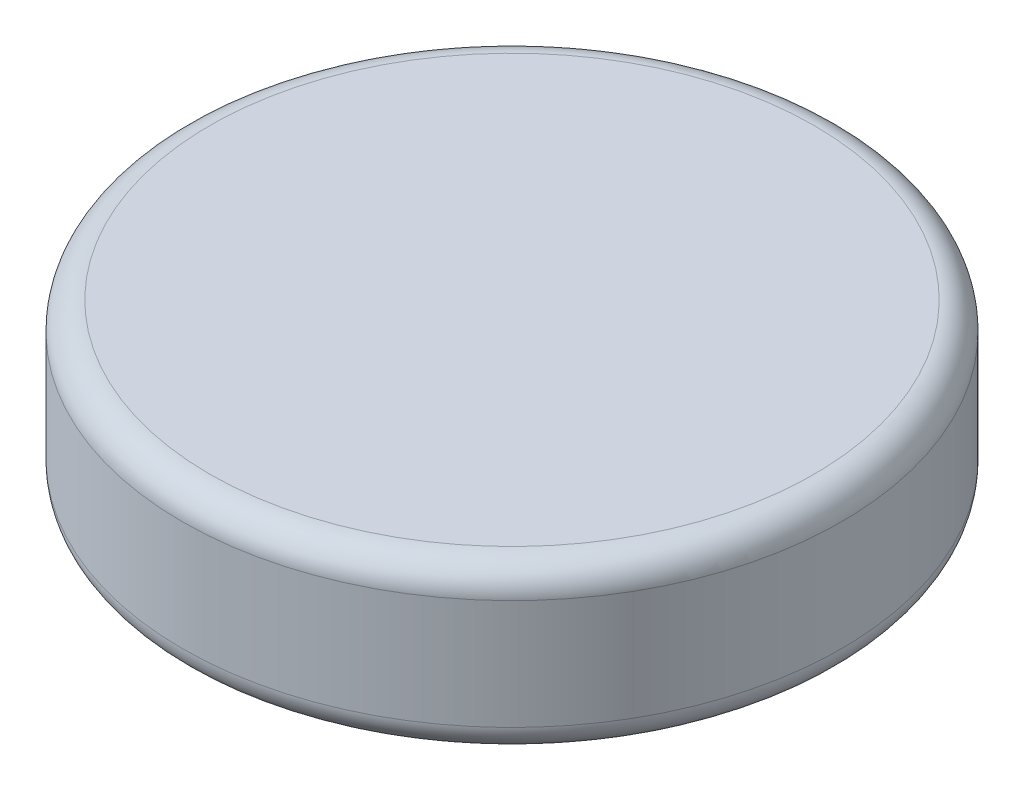
ISO-10303-21;
HEADER;
FILE_DESCRIPTION(('STEP AP214'),'2;1');
FILE_NAME('part.step','',(''),(''),'','','');
FILE_SCHEMA(('AUTOMOTIVE_DESIGN { 1 0 10303 214 1 1 1 1 }'));
ENDSEC;
DATA;
#1=APPLICATION_CONTEXT('core data for automotive mechanical design processes');
#2=APPLICATION_PROTOCOL_DEFINITION('international standard','automotive_design',2000,#1);
#3=PRODUCT_CONTEXT('',#1,'mechanical');
#4=PRODUCT('Part','Part','',(#3));
#5=PRODUCT_RELATED_PRODUCT_CATEGORY('part','',(#4));
#6=PRODUCT_DEFINITION_FORMATION('','',#4);
#7=PRODUCT_DEFINITION_CONTEXT('part definition',#1,'design');
#8=PRODUCT_DEFINITION('design','',#6,#7);
#9=PRODUCT_DEFINITION_SHAPE('','',#8);
#10=(LENGTH_UNIT() NAMED_UNIT(*) SI_UNIT(.MILLI.,.METRE.));
#11=(NAMED_UNIT(*) PLANE_ANGLE_UNIT() SI_UNIT($,.RADIAN.));
#12=(NAMED_UNIT(*) SI_UNIT($,.STERADIAN.) SOLID_ANGLE_UNIT());
#13=UNCERTAINTY_MEASURE_WITH_UNIT(LENGTH_MEASURE(1.E-05),#10,'distance_accuracy_value','');
#14=(GEOMETRIC_REPRESENTATION_CONTEXT(3) GLOBAL_UNCERTAINTY_ASSIGNED_CONTEXT((#13)) GLOBAL_UNIT_ASSIGNED_CONTEXT((#10,
#11,#12)) REPRESENTATION_CONTEXT('',''));
#15=CARTESIAN_POINT('',(0.,0.,0.));
#16=DIRECTION('',(0.,0.,1.));
#17=DIRECTION('',(1.,0.,0.));
#18=AXIS2_PLACEMENT_3D('',#15,#16,#17);
#19=CARTESIAN_POINT('',(0.,3.,0.));
#20=DIRECTION('',(0.,-1.,0.));
#21=DIRECTION('',(0.,0.,-1.));
#22=AXIS2_PLACEMENT_3D('',#19,#20,#21);
#23=CYLINDRICAL_SURFACE('',#22,6.);
#24=CARTESIAN_POINT('',(0.,0.5,0.));
#25=DIRECTION('',(0.,1.,0.));
#26=DIRECTION('',(0.,0.,1.));
#27=AXIS2_PLACEMENT_3D('',#24,#25,#26);
#28=CIRCLE('',#27,6.);
#29=CARTESIAN_POINT('',(0.,0.5,6.));
#30=VERTEX_POINT('',#29);
#31=EDGE_CURVE('E48',#30,#30,#28,.T.);
#32=ORIENTED_EDGE('',*,*,#31,.T.);
#33=EDGE_LOOP('',(#32));
#34=FACE_BOUND('',#33,.T.);
#35=CARTESIAN_POINT('',(0.,2.5,0.));
#36=DIRECTION('',(0.,1.,0.));
#37=DIRECTION('',(0.,0.,1.));
#38=AXIS2_PLACEMENT_3D('',#35,#36,#37);
#39=CIRCLE('',#38,6.);
#40=CARTESIAN_POINT('',(0.,2.5,6.));
#41=VERTEX_POINT('',#40);
#42=EDGE_CURVE('E52',#41,#41,#39,.F.);
#43=ORIENTED_EDGE('',*,*,#42,.T.);
#44=EDGE_LOOP('',(#43));
#45=FACE_BOUND('',#44,.T.);
#46=ADVANCED_FACE('F37',(#34,#45),#23,.T.);
#47=CARTESIAN_POINT('',(0.,3.,0.));
#48=DIRECTION('',(0.,1.,0.));
#49=DIRECTION('',(0.,0.,1.));
#50=AXIS2_PLACEMENT_3D('',#47,#48,#49);
#51=PLANE('',#50);
#52=CARTESIAN_POINT('',(0.,3.,0.));
#53=DIRECTION('',(0.,1.,0.));
#54=DIRECTION('',(0.,0.,1.));
#55=AXIS2_PLACEMENT_3D('',#52,#53,#54);
#56=CIRCLE('',#55,5.5);
#57=CARTESIAN_POINT('',(0.,3.,5.5));
#58=VERTEX_POINT('',#57);
#59=EDGE_CURVE('E10',#58,#58,#56,.T.);
#60=ORIENTED_EDGE('',*,*,#59,.T.);
#61=EDGE_LOOP('',(#60));
#62=FACE_BOUND('',#61,.T.);
#63=ADVANCED_FACE('F68',(#62),#51,.T.);
#64=CARTESIAN_POINT('',(0.,0.,0.));
#65=DIRECTION('',(0.,1.,0.));
#66=DIRECTION('',(0.,0.,1.));
#67=AXIS2_PLACEMENT_3D('',#64,#65,#66);
#68=PLANE('',#67);
#69=CARTESIAN_POINT('',(0.,0.,0.));
#70=DIRECTION('',(0.,1.,0.));
#71=DIRECTION('',(0.,0.,1.));
#72=AXIS2_PLACEMENT_3D('',#69,#70,#71);
#73=CIRCLE('',#72,5.5);
#74=CARTESIAN_POINT('',(0.,0.,5.5));
#75=VERTEX_POINT('',#74);
#76=EDGE_CURVE('E44',#75,#75,#73,.F.);
#77=ORIENTED_EDGE('',*,*,#76,.T.);
#78=EDGE_LOOP('',(#77));
#79=FACE_BOUND('',#78,.T.);
#80=ADVANCED_FACE('F65',(#79),#68,.F.);
#81=CARTESIAN_POINT('',(0.,0.5,0.));
#82=DIRECTION('',(0.,1.,0.));
#83=DIRECTION('',(0.,0.,1.));
#84=AXIS2_PLACEMENT_3D('',#81,#82,#83);
#85=TOROIDAL_SURFACE('',#84,5.5,0.5);
#86=ORIENTED_EDGE('',*,*,#76,.F.);
#87=EDGE_LOOP('',(#86));
#88=FACE_BOUND('',#87,.T.);
#89=ORIENTED_EDGE('',*,*,#31,.F.);
#90=EDGE_LOOP('',(#89));
#91=FACE_BOUND('',#90,.T.);
#92=ADVANCED_FACE('F61',(#88,#91),#85,.T.);
#93=CARTESIAN_POINT('',(0.,2.5,0.));
#94=DIRECTION('',(0.,1.,0.));
#95=DIRECTION('',(0.,0.,1.));
#96=AXIS2_PLACEMENT_3D('',#93,#94,#95);
#97=TOROIDAL_SURFACE('',#96,5.5,0.5);
#98=ORIENTED_EDGE('',*,*,#42,.F.);
#99=EDGE_LOOP('',(#98));
#100=FACE_BOUND('',#99,.T.);
#101=ORIENTED_EDGE('',*,*,#59,.F.);
#102=EDGE_LOOP('',(#101));
#103=FACE_BOUND('',#102,.T.);
#104=ADVANCED_FACE('F39',(#100,#103),#97,.T.);
#105=CLOSED_SHELL('',(#46,#63,#80,#92,#104));
#106=MANIFOLD_SOLID_BREP('B2',#105);
#107=ADVANCED_BREP_SHAPE_REPRESENTATION('',(#18,#106),#14);
#108=SHAPE_DEFINITION_REPRESENTATION(#9,#107);
ENDSEC;
END-ISO-10303-21;
